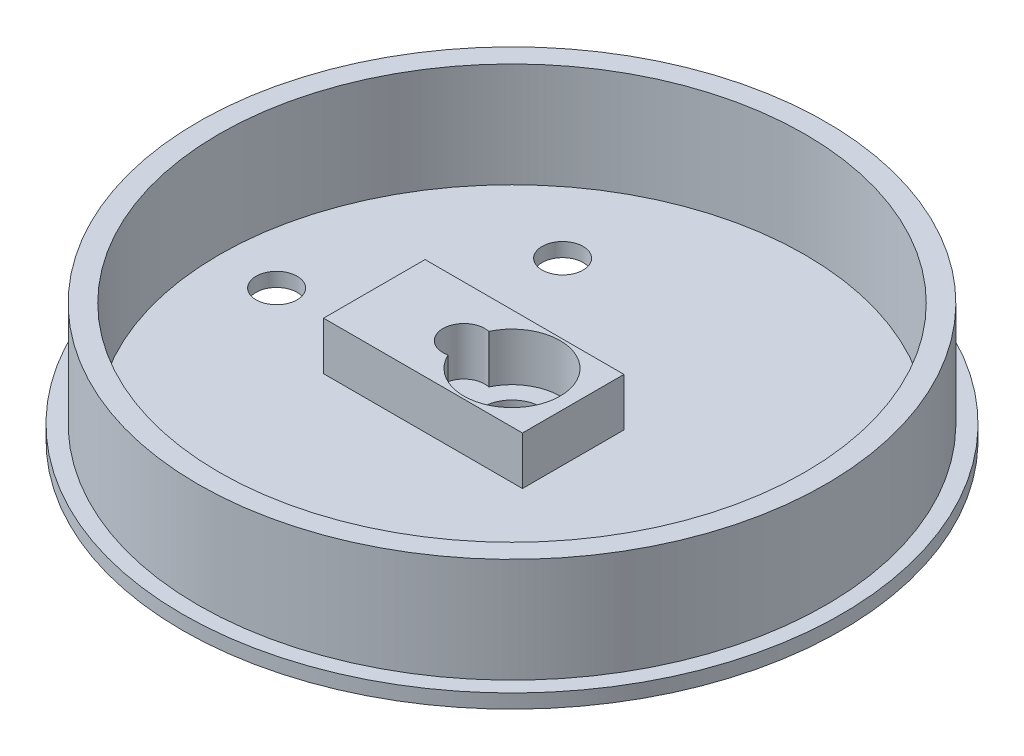
ISO-10303-21;
HEADER;
FILE_DESCRIPTION(('STEP AP214'),'2;1');
FILE_NAME('part.step','',(''),(''),'','','');
FILE_SCHEMA(('AUTOMOTIVE_DESIGN { 1 0 10303 214 1 1 1 1 }'));
ENDSEC;
DATA;
#1=APPLICATION_CONTEXT('core data for automotive mechanical design processes');
#2=APPLICATION_PROTOCOL_DEFINITION('international standard','automotive_design',2000,#1);
#3=PRODUCT_CONTEXT('',#1,'mechanical');
#4=PRODUCT('Part','Part','',(#3));
#5=PRODUCT_RELATED_PRODUCT_CATEGORY('part','',(#4));
#6=PRODUCT_DEFINITION_FORMATION('','',#4);
#7=PRODUCT_DEFINITION_CONTEXT('part definition',#1,'design');
#8=PRODUCT_DEFINITION('design','',#6,#7);
#9=PRODUCT_DEFINITION_SHAPE('','',#8);
#10=(LENGTH_UNIT() NAMED_UNIT(*) SI_UNIT(.MILLI.,.METRE.));
#11=(NAMED_UNIT(*) PLANE_ANGLE_UNIT() SI_UNIT($,.RADIAN.));
#12=(NAMED_UNIT(*) SI_UNIT($,.STERADIAN.) SOLID_ANGLE_UNIT());
#13=UNCERTAINTY_MEASURE_WITH_UNIT(LENGTH_MEASURE(1.E-05),#10,'distance_accuracy_value','');
#14=(GEOMETRIC_REPRESENTATION_CONTEXT(3) GLOBAL_UNCERTAINTY_ASSIGNED_CONTEXT((#13)) GLOBAL_UNIT_ASSIGNED_CONTEXT((#10,
#11,#12)) REPRESENTATION_CONTEXT('',''));
#15=CARTESIAN_POINT('',(0.,0.,0.));
#16=DIRECTION('',(0.,0.,1.));
#17=DIRECTION('',(1.,0.,0.));
#18=AXIS2_PLACEMENT_3D('',#15,#16,#17);
#19=CARTESIAN_POINT('',(0.,1.7018,0.));
#20=DIRECTION('',(0.,1.,0.));
#21=DIRECTION('',(0.,0.,1.));
#22=AXIS2_PLACEMENT_3D('',#19,#20,#21);
#23=PLANE('',#22);
#24=DIRECTION('',(0.,0.,-1.));
#25=VECTOR('',#24,1.);
#26=CARTESIAN_POINT('',(-16.7132,1.7018,0.));
#27=LINE('',#26,#25);
#28=CARTESIAN_POINT('',(-16.7132,1.70180000000003,6.15950000000001));
#29=VERTEX_POINT('',#28);
#30=CARTESIAN_POINT('',(-16.7132,1.70180000000003,-6.15949999999999));
#31=VERTEX_POINT('',#30);
#32=EDGE_CURVE('E168',#29,#31,#27,.T.);
#33=ORIENTED_EDGE('',*,*,#32,.T.);
#34=DIRECTION('',(-1.,0.,0.));
#35=VECTOR('',#34,1.);
#36=CARTESIAN_POINT('',(0.,1.7018,-6.1595));
#37=LINE('',#36,#35);
#38=CARTESIAN_POINT('',(7.4295,1.70180000000003,-6.1595));
#39=VERTEX_POINT('',#38);
#40=EDGE_CURVE('E171',#39,#31,#37,.T.);
#41=ORIENTED_EDGE('',*,*,#40,.F.);
#42=DIRECTION('',(0.,0.,-1.));
#43=VECTOR('',#42,1.);
#44=CARTESIAN_POINT('',(7.4295,1.7018,0.));
#45=LINE('',#44,#43);
#46=CARTESIAN_POINT('',(7.4295,1.70180000000003,6.1595));
#47=VERTEX_POINT('',#46);
#48=EDGE_CURVE('E103',#47,#39,#45,.T.);
#49=ORIENTED_EDGE('',*,*,#48,.F.);
#50=DIRECTION('',(1.,0.,0.));
#51=VECTOR('',#50,1.);
#52=CARTESIAN_POINT('',(0.,1.7018,6.1595));
#53=LINE('',#52,#51);
#54=EDGE_CURVE('E242',#29,#47,#53,.T.);
#55=ORIENTED_EDGE('',*,*,#54,.F.);
#56=EDGE_LOOP('',(#33,#41,#49,#55));
#57=FACE_BOUND('',#56,.T.);
#58=CARTESIAN_POINT('',(28.575,1.7018,0.));
#59=DIRECTION('',(0.,1.,0.));
#60=DIRECTION('',(0.,0.,1.));
#61=AXIS2_PLACEMENT_3D('',#58,#59,#60);
#62=CIRCLE('',#61,2.4892);
#63=CARTESIAN_POINT('',(28.575,1.7018,2.4892));
#64=VERTEX_POINT('',#63);
#65=EDGE_CURVE('E194',#64,#64,#62,.F.);
#66=ORIENTED_EDGE('',*,*,#65,.T.);
#67=EDGE_LOOP('',(#66));
#68=FACE_BOUND('',#67,.T.);
#69=CARTESIAN_POINT('',(-14.3480145553214,1.7018,-20.4910883878891));
#70=DIRECTION('',(0.,1.,0.));
#71=DIRECTION('',(0.,0.,1.));
#72=AXIS2_PLACEMENT_3D('',#69,#70,#71);
#73=CIRCLE('',#72,2.4892);
#74=CARTESIAN_POINT('',(-14.3480145553214,1.7018,-18.0018883878891));
#75=VERTEX_POINT('',#74);
#76=EDGE_CURVE('E176',#75,#75,#73,.T.);
#77=ORIENTED_EDGE('',*,*,#76,.F.);
#78=EDGE_LOOP('',(#77));
#79=FACE_BOUND('',#78,.T.);
#80=CARTESIAN_POINT('',(14.3480145553215,1.7018,20.4910883878891));
#81=DIRECTION('',(0.,1.,0.));
#82=DIRECTION('',(0.,0.,1.));
#83=AXIS2_PLACEMENT_3D('',#80,#81,#82);
#84=CIRCLE('',#83,2.4892);
#85=CARTESIAN_POINT('',(14.3480145553215,1.7018,22.9802883878891));
#86=VERTEX_POINT('',#85);
#87=EDGE_CURVE('E245',#86,#86,#84,.T.);
#88=ORIENTED_EDGE('',*,*,#87,.F.);
#89=EDGE_LOOP('',(#88));
#90=FACE_BOUND('',#89,.T.);
#91=CARTESIAN_POINT('',(-28.575,1.7018,0.));
#92=DIRECTION('',(0.,1.,0.));
#93=DIRECTION('',(0.,0.,1.));
#94=AXIS2_PLACEMENT_3D('',#91,#92,#93);
#95=CIRCLE('',#94,2.4892);
#96=CARTESIAN_POINT('',(-28.575,1.7018,2.4892));
#97=VERTEX_POINT('',#96);
#98=EDGE_CURVE('E190',#97,#97,#95,.T.);
#99=ORIENTED_EDGE('',*,*,#98,.F.);
#100=EDGE_LOOP('',(#99));
#101=FACE_BOUND('',#100,.T.);
#102=CARTESIAN_POINT('',(0.,1.7018,0.));
#103=DIRECTION('',(0.,1.,0.));
#104=DIRECTION('',(0.,0.,1.));
#105=AXIS2_PLACEMENT_3D('',#102,#103,#104);
#106=CIRCLE('',#105,35.56);
#107=CARTESIAN_POINT('',(0.,1.7018,35.56));
#108=VERTEX_POINT('',#107);
#109=EDGE_CURVE('E12',#108,#108,#106,.F.);
#110=ORIENTED_EDGE('',*,*,#109,.F.);
#111=EDGE_LOOP('',(#110));
#112=FACE_BOUND('',#111,.T.);
#113=ADVANCED_FACE('F95',(#57,#68,#79,#90,#101,#112),#23,.T.);
#114=CARTESIAN_POINT('',(0.,1.7018,-6.1595));
#115=DIRECTION('',(0.,0.,1.));
#116=DIRECTION('',(1.,0.,0.));
#117=AXIS2_PLACEMENT_3D('',#114,#115,#116);
#118=PLANE('',#117);
#119=DIRECTION('',(0.,-1.,0.));
#120=VECTOR('',#119,1.);
#121=CARTESIAN_POINT('',(7.4295,1.7018,-6.1595));
#122=LINE('',#121,#120);
#123=CARTESIAN_POINT('',(7.4295,7.5438,-6.1595));
#124=VERTEX_POINT('',#123);
#125=EDGE_CURVE('E162',#124,#39,#122,.T.);
#126=ORIENTED_EDGE('',*,*,#125,.T.);
#127=ORIENTED_EDGE('',*,*,#40,.T.);
#128=DIRECTION('',(0.,-1.,0.));
#129=VECTOR('',#128,1.);
#130=CARTESIAN_POINT('',(-16.7132,1.7018,-6.15949999999999));
#131=LINE('',#130,#129);
#132=CARTESIAN_POINT('',(-16.7132,7.5438,-6.15949999999999));
#133=VERTEX_POINT('',#132);
#134=EDGE_CURVE('E182',#133,#31,#131,.T.);
#135=ORIENTED_EDGE('',*,*,#134,.F.);
#136=DIRECTION('',(1.,0.,0.));
#137=VECTOR('',#136,1.);
#138=CARTESIAN_POINT('',(0.,7.5438,-6.1595));
#139=LINE('',#138,#137);
#140=EDGE_CURVE('E181',#133,#124,#139,.T.);
#141=ORIENTED_EDGE('',*,*,#140,.T.);
#142=EDGE_LOOP('',(#126,#127,#135,#141));
#143=FACE_BOUND('',#142,.T.);
#144=ADVANCED_FACE('F179',(#143),#118,.F.);
#145=DIRECTION('',(-1.,0.,0.));
#146=VECTOR('',#145,1.);
#147=CARTESIAN_POINT('',(0.,1.7018,2.4892));
#148=LINE('',#147,#146);
#149=CARTESIAN_POINT('',(-5.28515348499928,1.7018,2.4892));
#150=VERTEX_POINT('',#149);
#151=CARTESIAN_POINT('',(-5.33654638194983,1.7018,2.4892));
#152=VERTEX_POINT('',#151);
#153=EDGE_CURVE('E175',#150,#152,#148,.T.);
#154=ORIENTED_EDGE('',*,*,#153,.F.);
#155=CARTESIAN_POINT('',(0.,1.7018,0.));
#156=DIRECTION('',(0.,1.,0.));
#157=DIRECTION('',(0.,0.,1.));
#158=AXIS2_PLACEMENT_3D('',#155,#156,#157);
#159=CIRCLE('',#158,5.842);
#160=CARTESIAN_POINT('',(-5.28515348499927,1.7018,-2.48920000000001));
#161=VERTEX_POINT('',#160);
#162=EDGE_CURVE('E224',#150,#161,#159,.T.);
#163=ORIENTED_EDGE('',*,*,#162,.T.);
#164=DIRECTION('',(-1.,0.,0.));
#165=VECTOR('',#164,1.);
#166=CARTESIAN_POINT('',(0.,1.7018,-2.4892));
#167=LINE('',#166,#165);
#168=CARTESIAN_POINT('',(-5.33654638194983,1.7018,-2.4892));
#169=VERTEX_POINT('',#168);
#170=EDGE_CURVE('E228',#161,#169,#167,.T.);
#171=ORIENTED_EDGE('',*,*,#170,.T.);
#172=CARTESIAN_POINT('',(-5.842,1.7018,0.));
#173=DIRECTION('',(0.,1.,0.));
#174=DIRECTION('',(0.,0.,1.));
#175=AXIS2_PLACEMENT_3D('',#172,#173,#174);
#176=CIRCLE('',#175,2.54);
#177=EDGE_CURVE('E231',#169,#152,#176,.T.);
#178=ORIENTED_EDGE('',*,*,#177,.T.);
#179=EDGE_LOOP('',(#154,#163,#171,#178));
#180=FACE_BOUND('',#179,.T.);
#181=CARTESIAN_POINT('',(0.,1.7018,0.));
#182=DIRECTION('',(0.,1.,0.));
#183=DIRECTION('',(0.,0.,1.));
#184=AXIS2_PLACEMENT_3D('',#181,#182,#183);
#185=CIRCLE('',#184,3.556);
#186=CARTESIAN_POINT('',(0.,1.7018,3.556));
#187=VERTEX_POINT('',#186);
#188=EDGE_CURVE('E204',#187,#187,#185,.T.);
#189=ORIENTED_EDGE('',*,*,#188,.F.);
#190=EDGE_LOOP('',(#189));
#191=FACE_BOUND('',#190,.T.);
#192=ADVANCED_FACE('F292',(#180,#191),#23,.T.);
#193=CARTESIAN_POINT('',(7.4295,1.7018,0.));
#194=DIRECTION('',(1.,0.,0.));
#195=DIRECTION('',(0.,0.,-1.));
#196=AXIS2_PLACEMENT_3D('',#193,#194,#195);
#197=PLANE('',#196);
#198=ORIENTED_EDGE('',*,*,#48,.T.);
#199=ORIENTED_EDGE('',*,*,#125,.F.);
#200=DIRECTION('',(0.,0.,-1.));
#201=VECTOR('',#200,1.);
#202=CARTESIAN_POINT('',(7.4295,7.5438,0.));
#203=LINE('',#202,#201);
#204=CARTESIAN_POINT('',(7.4295,7.5438,6.1595));
#205=VERTEX_POINT('',#204);
#206=EDGE_CURVE('E215',#205,#124,#203,.T.);
#207=ORIENTED_EDGE('',*,*,#206,.F.);
#208=DIRECTION('',(0.,-1.,0.));
#209=VECTOR('',#208,1.);
#210=CARTESIAN_POINT('',(7.4295,1.7018,6.1595));
#211=LINE('',#210,#209);
#212=EDGE_CURVE('E164',#205,#47,#211,.T.);
#213=ORIENTED_EDGE('',*,*,#212,.T.);
#214=EDGE_LOOP('',(#198,#199,#207,#213));
#215=FACE_BOUND('',#214,.T.);
#216=ADVANCED_FACE('F159',(#215),#197,.T.);
#217=CARTESIAN_POINT('',(-16.7132,1.7018,0.));
#218=DIRECTION('',(1.,0.,0.));
#219=DIRECTION('',(0.,0.,-1.));
#220=AXIS2_PLACEMENT_3D('',#217,#218,#219);
#221=PLANE('',#220);
#222=ORIENTED_EDGE('',*,*,#134,.T.);
#223=ORIENTED_EDGE('',*,*,#32,.F.);
#224=DIRECTION('',(0.,-1.,0.));
#225=VECTOR('',#224,1.);
#226=CARTESIAN_POINT('',(-16.7132,1.7018,6.15950000000001));
#227=LINE('',#226,#225);
#228=CARTESIAN_POINT('',(-16.7132,7.5438,6.15950000000001));
#229=VERTEX_POINT('',#228);
#230=EDGE_CURVE('E184',#229,#29,#227,.T.);
#231=ORIENTED_EDGE('',*,*,#230,.F.);
#232=DIRECTION('',(0.,0.,-1.));
#233=VECTOR('',#232,1.);
#234=CARTESIAN_POINT('',(-16.7132,7.5438,0.));
#235=LINE('',#234,#233);
#236=EDGE_CURVE('E211',#229,#133,#235,.T.);
#237=ORIENTED_EDGE('',*,*,#236,.T.);
#238=EDGE_LOOP('',(#222,#223,#231,#237));
#239=FACE_BOUND('',#238,.T.);
#240=ADVANCED_FACE('F324',(#239),#221,.F.);
#241=CARTESIAN_POINT('',(0.,1.7018,6.1595));
#242=DIRECTION('',(0.,0.,1.));
#243=DIRECTION('',(1.,0.,0.));
#244=AXIS2_PLACEMENT_3D('',#241,#242,#243);
#245=PLANE('',#244);
#246=ORIENTED_EDGE('',*,*,#54,.T.);
#247=ORIENTED_EDGE('',*,*,#212,.F.);
#248=DIRECTION('',(1.,0.,0.));
#249=VECTOR('',#248,1.);
#250=CARTESIAN_POINT('',(0.,7.5438,6.1595));
#251=LINE('',#250,#249);
#252=EDGE_CURVE('E201',#229,#205,#251,.T.);
#253=ORIENTED_EDGE('',*,*,#252,.F.);
#254=ORIENTED_EDGE('',*,*,#230,.T.);
#255=EDGE_LOOP('',(#246,#247,#253,#254));
#256=FACE_BOUND('',#255,.T.);
#257=ADVANCED_FACE('F333',(#256),#245,.T.);
#258=CARTESIAN_POINT('',(0.,1.7018,0.));
#259=DIRECTION('',(0.,-1.,0.));
#260=DIRECTION('',(0.,0.,-1.));
#261=AXIS2_PLACEMENT_3D('',#258,#259,#260);
#262=CYLINDRICAL_SURFACE('',#261,3.556);
#263=ORIENTED_EDGE('',*,*,#188,.T.);
#264=EDGE_LOOP('',(#263));
#265=FACE_BOUND('',#264,.T.);
#266=CARTESIAN_POINT('',(0.,0.,0.));
#267=DIRECTION('',(0.,1.,0.));
#268=DIRECTION('',(0.,0.,1.));
#269=AXIS2_PLACEMENT_3D('',#266,#267,#268);
#270=CIRCLE('',#269,3.556);
#271=CARTESIAN_POINT('',(0.,0.,3.556));
#272=VERTEX_POINT('',#271);
#273=EDGE_CURVE('E195',#272,#272,#270,.T.);
#274=ORIENTED_EDGE('',*,*,#273,.F.);
#275=EDGE_LOOP('',(#274));
#276=FACE_BOUND('',#275,.T.);
#277=ADVANCED_FACE('F330',(#265,#276),#262,.F.);
#278=CARTESIAN_POINT('',(28.575,1.7018,0.));
#279=DIRECTION('',(0.,-1.,0.));
#280=DIRECTION('',(0.,0.,-1.));
#281=AXIS2_PLACEMENT_3D('',#278,#279,#280);
#282=CYLINDRICAL_SURFACE('',#281,2.4892);
#283=ORIENTED_EDGE('',*,*,#65,.F.);
#284=EDGE_LOOP('',(#283));
#285=FACE_BOUND('',#284,.T.);
#286=CARTESIAN_POINT('',(28.575,0.,0.));
#287=DIRECTION('',(0.,1.,0.));
#288=DIRECTION('',(0.,0.,1.));
#289=AXIS2_PLACEMENT_3D('',#286,#287,#288);
#290=CIRCLE('',#289,2.4892);
#291=CARTESIAN_POINT('',(28.575,0.,2.4892));
#292=VERTEX_POINT('',#291);
#293=EDGE_CURVE('E198',#292,#292,#290,.F.);
#294=ORIENTED_EDGE('',*,*,#293,.T.);
#295=EDGE_LOOP('',(#294));
#296=FACE_BOUND('',#295,.T.);
#297=ADVANCED_FACE('F97',(#285,#296),#282,.F.);
#298=CARTESIAN_POINT('',(-28.575,1.7018,0.));
#299=DIRECTION('',(0.,-1.,0.));
#300=DIRECTION('',(0.,0.,-1.));
#301=AXIS2_PLACEMENT_3D('',#298,#299,#300);
#302=CYLINDRICAL_SURFACE('',#301,2.4892);
#303=ORIENTED_EDGE('',*,*,#98,.T.);
#304=EDGE_LOOP('',(#303));
#305=FACE_BOUND('',#304,.T.);
#306=CARTESIAN_POINT('',(-28.575,0.,0.));
#307=DIRECTION('',(0.,1.,0.));
#308=DIRECTION('',(0.,0.,1.));
#309=AXIS2_PLACEMENT_3D('',#306,#307,#308);
#310=CIRCLE('',#309,2.4892);
#311=CARTESIAN_POINT('',(-28.575,0.,2.4892));
#312=VERTEX_POINT('',#311);
#313=EDGE_CURVE('E191',#312,#312,#310,.T.);
#314=ORIENTED_EDGE('',*,*,#313,.F.);
#315=EDGE_LOOP('',(#314));
#316=FACE_BOUND('',#315,.T.);
#317=ADVANCED_FACE('F290',(#305,#316),#302,.F.);
#318=CARTESIAN_POINT('',(0.,1.7018,0.));
#319=DIRECTION('',(0.,1.,0.));
#320=DIRECTION('',(0.,0.,1.));
#321=AXIS2_PLACEMENT_3D('',#318,#319,#320);
#322=CIRCLE('',#321,38.1);
#323=CARTESIAN_POINT('',(0.,1.7018,38.1));
#324=VERTEX_POINT('',#323);
#325=EDGE_CURVE('E262',#324,#324,#322,.T.);
#326=ORIENTED_EDGE('',*,*,#325,.F.);
#327=EDGE_LOOP('',(#326));
#328=FACE_BOUND('',#327,.T.);
#329=CARTESIAN_POINT('',(0.,1.7018,0.));
#330=DIRECTION('',(0.,1.,0.));
#331=DIRECTION('',(0.,0.,1.));
#332=AXIS2_PLACEMENT_3D('',#329,#330,#331);
#333=CIRCLE('',#332,40.005);
#334=CARTESIAN_POINT('',(0.,1.70179999999999,-40.005));
#335=VERTEX_POINT('',#334);
#336=EDGE_CURVE('E256',#335,#335,#333,.F.);
#337=ORIENTED_EDGE('',*,*,#336,.F.);
#338=EDGE_LOOP('',(#337));
#339=FACE_BOUND('',#338,.T.);
#340=ADVANCED_FACE('F286',(#328,#339),#23,.T.);
#341=CARTESIAN_POINT('',(0.,0.,0.));
#342=DIRECTION('',(0.,1.,0.));
#343=DIRECTION('',(0.,0.,1.));
#344=AXIS2_PLACEMENT_3D('',#341,#342,#343);
#345=PLANE('',#344);
#346=ORIENTED_EDGE('',*,*,#293,.F.);
#347=EDGE_LOOP('',(#346));
#348=FACE_BOUND('',#347,.T.);
#349=ORIENTED_EDGE('',*,*,#273,.T.);
#350=EDGE_LOOP('',(#349));
#351=FACE_BOUND('',#350,.T.);
#352=ORIENTED_EDGE('',*,*,#313,.T.);
#353=EDGE_LOOP('',(#352));
#354=FACE_BOUND('',#353,.T.);
#355=CARTESIAN_POINT('',(14.3480145553215,0.,20.4910883878891));
#356=DIRECTION('',(0.,1.,0.));
#357=DIRECTION('',(0.,0.,1.));
#358=AXIS2_PLACEMENT_3D('',#355,#356,#357);
#359=CIRCLE('',#358,2.4892);
#360=CARTESIAN_POINT('',(14.3480145553215,0.,22.9802883878891));
#361=VERTEX_POINT('',#360);
#362=EDGE_CURVE('E246',#361,#361,#359,.T.);
#363=ORIENTED_EDGE('',*,*,#362,.T.);
#364=EDGE_LOOP('',(#363));
#365=FACE_BOUND('',#364,.T.);
#366=CARTESIAN_POINT('',(-14.3480145553214,0.,-20.4910883878891));
#367=DIRECTION('',(0.,1.,0.));
#368=DIRECTION('',(0.,0.,1.));
#369=AXIS2_PLACEMENT_3D('',#366,#367,#368);
#370=CIRCLE('',#369,2.4892);
#371=CARTESIAN_POINT('',(-14.3480145553214,0.,-18.0018883878891));
#372=VERTEX_POINT('',#371);
#373=EDGE_CURVE('E244',#372,#372,#370,.T.);
#374=ORIENTED_EDGE('',*,*,#373,.T.);
#375=EDGE_LOOP('',(#374));
#376=FACE_BOUND('',#375,.T.);
#377=CARTESIAN_POINT('',(0.,0.,0.));
#378=DIRECTION('',(0.,-1.,0.));
#379=DIRECTION('',(0.,0.,-1.));
#380=AXIS2_PLACEMENT_3D('',#377,#378,#379);
#381=CIRCLE('',#380,40.005);
#382=CARTESIAN_POINT('',(0.,0.,-40.005));
#383=VERTEX_POINT('',#382);
#384=EDGE_CURVE('E249',#383,#383,#381,.T.);
#385=ORIENTED_EDGE('',*,*,#384,.T.);
#386=EDGE_LOOP('',(#385));
#387=FACE_BOUND('',#386,.T.);
#388=ADVANCED_FACE('F289',(#348,#351,#354,#365,#376,#387),#345,.F.);
#389=CARTESIAN_POINT('',(0.,7.5438,0.));
#390=DIRECTION('',(0.,-1.,0.));
#391=DIRECTION('',(0.,0.,-1.));
#392=AXIS2_PLACEMENT_3D('',#389,#390,#391);
#393=PLANE('',#392);
#394=CARTESIAN_POINT('',(0.,7.5438,0.));
#395=DIRECTION('',(0.,1.,0.));
#396=DIRECTION('',(0.,0.,1.));
#397=AXIS2_PLACEMENT_3D('',#394,#395,#396);
#398=CIRCLE('',#397,5.842);
#399=CARTESIAN_POINT('',(-5.28515348499928,7.5438,2.4892));
#400=VERTEX_POINT('',#399);
#401=CARTESIAN_POINT('',(-5.28515348499927,7.5438,-2.48920000000001));
#402=VERTEX_POINT('',#401);
#403=EDGE_CURVE('E219',#400,#402,#398,.T.);
#404=ORIENTED_EDGE('',*,*,#403,.F.);
#405=DIRECTION('',(-1.,0.,0.));
#406=VECTOR('',#405,1.);
#407=CARTESIAN_POINT('',(0.,7.5438,2.4892));
#408=LINE('',#407,#406);
#409=CARTESIAN_POINT('',(-5.33654638194983,7.5438,2.4892));
#410=VERTEX_POINT('',#409);
#411=EDGE_CURVE('E227',#400,#410,#408,.T.);
#412=ORIENTED_EDGE('',*,*,#411,.T.);
#413=CARTESIAN_POINT('',(-5.842,7.5438,0.));
#414=DIRECTION('',(0.,1.,0.));
#415=DIRECTION('',(0.,0.,1.));
#416=AXIS2_PLACEMENT_3D('',#413,#414,#415);
#417=CIRCLE('',#416,2.54);
#418=CARTESIAN_POINT('',(-5.33654638194983,7.5438,-2.4892));
#419=VERTEX_POINT('',#418);
#420=EDGE_CURVE('E238',#419,#410,#417,.T.);
#421=ORIENTED_EDGE('',*,*,#420,.F.);
#422=DIRECTION('',(-1.,0.,0.));
#423=VECTOR('',#422,1.);
#424=CARTESIAN_POINT('',(0.,7.5438,-2.4892));
#425=LINE('',#424,#423);
#426=EDGE_CURVE('E236',#402,#419,#425,.T.);
#427=ORIENTED_EDGE('',*,*,#426,.F.);
#428=EDGE_LOOP('',(#404,#412,#421,#427));
#429=FACE_BOUND('',#428,.T.);
#430=ORIENTED_EDGE('',*,*,#206,.T.);
#431=ORIENTED_EDGE('',*,*,#140,.F.);
#432=ORIENTED_EDGE('',*,*,#236,.F.);
#433=ORIENTED_EDGE('',*,*,#252,.T.);
#434=EDGE_LOOP('',(#430,#431,#432,#433));
#435=FACE_BOUND('',#434,.T.);
#436=ADVANCED_FACE('F337',(#429,#435),#393,.F.);
#437=CARTESIAN_POINT('',(0.,7.5438,2.4892));
#438=DIRECTION('',(0.,0.,1.));
#439=DIRECTION('',(1.,0.,0.));
#440=AXIS2_PLACEMENT_3D('',#437,#438,#439);
#441=PLANE('',#440);
#442=ORIENTED_EDGE('',*,*,#153,.T.);
#443=DIRECTION('',(0.,-1.,0.));
#444=VECTOR('',#443,1.);
#445=CARTESIAN_POINT('',(-5.33654638194983,7.5438,2.4892));
#446=LINE('',#445,#444);
#447=EDGE_CURVE('E110',#410,#152,#446,.T.);
#448=ORIENTED_EDGE('',*,*,#447,.F.);
#449=ORIENTED_EDGE('',*,*,#411,.F.);
#450=DIRECTION('',(0.,-1.,0.));
#451=VECTOR('',#450,1.);
#452=CARTESIAN_POINT('',(-5.28515348499928,7.5438,2.4892));
#453=LINE('',#452,#451);
#454=EDGE_CURVE('E217',#400,#150,#453,.T.);
#455=ORIENTED_EDGE('',*,*,#454,.T.);
#456=EDGE_LOOP('',(#442,#448,#449,#455));
#457=FACE_BOUND('',#456,.T.);
#458=ADVANCED_FACE('F360',(#457),#441,.F.);
#459=CARTESIAN_POINT('',(0.,7.5438,0.));
#460=DIRECTION('',(0.,-1.,0.));
#461=DIRECTION('',(0.,0.,-1.));
#462=AXIS2_PLACEMENT_3D('',#459,#460,#461);
#463=CYLINDRICAL_SURFACE('',#462,5.842);
#464=ORIENTED_EDGE('',*,*,#162,.F.);
#465=ORIENTED_EDGE('',*,*,#454,.F.);
#466=ORIENTED_EDGE('',*,*,#403,.T.);
#467=DIRECTION('',(0.,-1.,0.));
#468=VECTOR('',#467,1.);
#469=CARTESIAN_POINT('',(-5.28515348499927,7.5438,-2.48920000000001));
#470=LINE('',#469,#468);
#471=EDGE_CURVE('E221',#402,#161,#470,.T.);
#472=ORIENTED_EDGE('',*,*,#471,.T.);
#473=EDGE_LOOP('',(#464,#465,#466,#472));
#474=FACE_BOUND('',#473,.T.);
#475=ADVANCED_FACE('F357',(#474),#463,.F.);
#476=CARTESIAN_POINT('',(0.,7.5438,-2.4892));
#477=DIRECTION('',(0.,0.,1.));
#478=DIRECTION('',(1.,0.,0.));
#479=AXIS2_PLACEMENT_3D('',#476,#477,#478);
#480=PLANE('',#479);
#481=ORIENTED_EDGE('',*,*,#170,.F.);
#482=ORIENTED_EDGE('',*,*,#471,.F.);
#483=ORIENTED_EDGE('',*,*,#426,.T.);
#484=DIRECTION('',(0.,-1.,0.));
#485=VECTOR('',#484,1.);
#486=CARTESIAN_POINT('',(-5.33654638194983,7.5438,-2.4892));
#487=LINE('',#486,#485);
#488=EDGE_CURVE('E115',#419,#169,#487,.T.);
#489=ORIENTED_EDGE('',*,*,#488,.T.);
#490=EDGE_LOOP('',(#481,#482,#483,#489));
#491=FACE_BOUND('',#490,.T.);
#492=ADVANCED_FACE('F354',(#491),#480,.T.);
#493=CARTESIAN_POINT('',(-5.842,7.5438,0.));
#494=DIRECTION('',(0.,-1.,0.));
#495=DIRECTION('',(0.,0.,-1.));
#496=AXIS2_PLACEMENT_3D('',#493,#494,#495);
#497=CYLINDRICAL_SURFACE('',#496,2.54);
#498=ORIENTED_EDGE('',*,*,#177,.F.);
#499=ORIENTED_EDGE('',*,*,#488,.F.);
#500=ORIENTED_EDGE('',*,*,#420,.T.);
#501=ORIENTED_EDGE('',*,*,#447,.T.);
#502=EDGE_LOOP('',(#498,#499,#500,#501));
#503=FACE_BOUND('',#502,.T.);
#504=ADVANCED_FACE('F348',(#503),#497,.F.);
#505=CARTESIAN_POINT('',(14.3480145553215,1.7018,20.4910883878891));
#506=DIRECTION('',(0.,-1.,0.));
#507=DIRECTION('',(0.,0.,-1.));
#508=AXIS2_PLACEMENT_3D('',#505,#506,#507);
#509=CYLINDRICAL_SURFACE('',#508,2.4892);
#510=ORIENTED_EDGE('',*,*,#87,.T.);
#511=EDGE_LOOP('',(#510));
#512=FACE_BOUND('',#511,.T.);
#513=ORIENTED_EDGE('',*,*,#362,.F.);
#514=EDGE_LOOP('',(#513));
#515=FACE_BOUND('',#514,.T.);
#516=ADVANCED_FACE('F307',(#512,#515),#509,.F.);
#517=CARTESIAN_POINT('',(-14.3480145553214,1.7018,-20.4910883878891));
#518=DIRECTION('',(0.,-1.,0.));
#519=DIRECTION('',(0.,0.,-1.));
#520=AXIS2_PLACEMENT_3D('',#517,#518,#519);
#521=CYLINDRICAL_SURFACE('',#520,2.4892);
#522=ORIENTED_EDGE('',*,*,#76,.T.);
#523=EDGE_LOOP('',(#522));
#524=FACE_BOUND('',#523,.T.);
#525=ORIENTED_EDGE('',*,*,#373,.F.);
#526=EDGE_LOOP('',(#525));
#527=FACE_BOUND('',#526,.T.);
#528=ADVANCED_FACE('F297',(#524,#527),#521,.F.);
#529=CARTESIAN_POINT('',(0.,114.853027125471,0.));
#530=DIRECTION('',(0.,-1.,0.));
#531=DIRECTION('',(0.,0.,-1.));
#532=AXIS2_PLACEMENT_3D('',#529,#530,#531);
#533=CYLINDRICAL_SURFACE('',#532,40.005);
#534=CARTESIAN_POINT('',(0.,0.,-40.005));
#535=CARTESIAN_POINT('',(0.,0.0177270833333492,-40.005));
#536=CARTESIAN_POINT('',(0.,0.0354541666666846,-40.005));
#537=CARTESIAN_POINT('',(0.,0.0709083333333508,-40.005));
#538=CARTESIAN_POINT('',(0.,0.0886354166666816,-40.005));
#539=CARTESIAN_POINT('',(0.,0.124089583333343,-40.005));
#540=CARTESIAN_POINT('',(0.,0.141816666666674,-40.005));
#541=CARTESIAN_POINT('',(0.,0.17727083333334,-40.005));
#542=CARTESIAN_POINT('',(0.,0.194997916666675,-40.005));
#543=CARTESIAN_POINT('',(0.,0.230452083333346,-40.005));
#544=CARTESIAN_POINT('',(0.,0.248179166666682,-40.005));
#545=CARTESIAN_POINT('',(0.,0.283633333333348,-40.005));
#546=CARTESIAN_POINT('',(0.,0.301360416666679,-40.005));
#547=CARTESIAN_POINT('',(0.,0.33681458333334,-40.005));
#548=CARTESIAN_POINT('',(0.,0.354541666666671,-40.005));
#549=CARTESIAN_POINT('',(0.,0.389995833333337,-40.005));
#550=CARTESIAN_POINT('',(0.,0.407722916666672,-40.005));
#551=CARTESIAN_POINT('',(0.,0.443177083333343,-40.005));
#552=CARTESIAN_POINT('',(0.,0.460904166666679,-40.005));
#553=CARTESIAN_POINT('',(0.,0.496358333333345,-40.005));
#554=CARTESIAN_POINT('',(0.,0.514085416666676,-40.005));
#555=CARTESIAN_POINT('',(0.,0.549539583333337,-40.005));
#556=CARTESIAN_POINT('',(0.,0.567266666666668,-40.005));
#557=CARTESIAN_POINT('',(0.,0.602720833333334,-40.005));
#558=CARTESIAN_POINT('',(0.,0.620447916666669,-40.005));
#559=CARTESIAN_POINT('',(0.,0.65590208333334,-40.005));
#560=CARTESIAN_POINT('',(0.,0.673629166666675,-40.005));
#561=CARTESIAN_POINT('',(0.,0.709083333333342,-40.005));
#562=CARTESIAN_POINT('',(0.,0.726810416666672,-40.005));
#563=CARTESIAN_POINT('',(0.,0.762264583333334,-40.005));
#564=CARTESIAN_POINT('',(0.,0.779991666666665,-40.005));
#565=CARTESIAN_POINT('',(0.,0.815445833333331,-40.005));
#566=CARTESIAN_POINT('',(0.,0.833172916666666,-40.005));
#567=CARTESIAN_POINT('',(0.,0.868627083333337,-40.005));
#568=CARTESIAN_POINT('',(0.,0.886354166666672,-40.005));
#569=CARTESIAN_POINT('',(0.,0.921808333333339,-40.005));
#570=CARTESIAN_POINT('',(0.,0.939535416666669,-40.005));
#571=CARTESIAN_POINT('',(0.,0.974989583333331,-40.005));
#572=CARTESIAN_POINT('',(0.,0.992716666666662,-40.005));
#573=CARTESIAN_POINT('',(0.,1.02817083333333,-40.005));
#574=CARTESIAN_POINT('',(0.,1.04589791666666,-40.005));
#575=CARTESIAN_POINT('',(0.,1.08135208333333,-40.005));
#576=CARTESIAN_POINT('',(0.,1.09907916666667,-40.005));
#577=CARTESIAN_POINT('',(0.,1.13453333333334,-40.005));
#578=CARTESIAN_POINT('',(0.,1.15226041666667,-40.005));
#579=CARTESIAN_POINT('',(0.,1.18771458333333,-40.005));
#580=CARTESIAN_POINT('',(0.,1.20544166666666,-40.005));
#581=CARTESIAN_POINT('',(0.,1.24089583333332,-40.005));
#582=CARTESIAN_POINT('',(0.,1.25862291666666,-40.005));
#583=CARTESIAN_POINT('',(0.,1.29407708333333,-40.005));
#584=CARTESIAN_POINT('',(0.,1.31180416666667,-40.005));
#585=CARTESIAN_POINT('',(0.,1.34725833333333,-40.005));
#586=CARTESIAN_POINT('',(0.,1.36498541666666,-40.005));
#587=CARTESIAN_POINT('',(0.,1.40043958333332,-40.005));
#588=CARTESIAN_POINT('',(0.,1.41816666666666,-40.005));
#589=CARTESIAN_POINT('',(0.,1.45362083333332,-40.005));
#590=CARTESIAN_POINT('',(0.,1.47134791666666,-40.005));
#591=CARTESIAN_POINT('',(0.,1.50680208333333,-40.005));
#592=CARTESIAN_POINT('',(0.,1.52452916666666,-40.005));
#593=CARTESIAN_POINT('',(0.,1.55998333333333,-40.005));
#594=CARTESIAN_POINT('',(0.,1.57771041666666,-40.005));
#595=CARTESIAN_POINT('',(0.,1.61316458333332,-40.005));
#596=CARTESIAN_POINT('',(0.,1.63089166666665,-40.005));
#597=CARTESIAN_POINT('',(0.,1.66634583333332,-40.005));
#598=CARTESIAN_POINT('',(0.,1.68407291666665,-40.005));
#599=CARTESIAN_POINT('',(0.,1.70179999999999,-40.005));
#600=B_SPLINE_CURVE_WITH_KNOTS('',3,(#534,#535,#536,#537,#538,#539,#540,#541,#542,#543,#544,
#545,#546,#547,#548,#549,#550,#551,#552,#553,#554,#555,#556,#557,#558,#559,#560,#561,#562,#563,
#564,#565,#566,#567,#568,#569,#570,#571,#572,#573,#574,#575,#576,#577,#578,#579,#580,#581,#582,
#583,#584,#585,#586,#587,#588,#589,#590,#591,#592,#593,#594,#595,#596,#597,#598,#599),
.UNSPECIFIED.,.F.,.F.,(4,2,2,2,2,2,2,2,2,2,2,2,2,2,2,2,2,2,2,2,2,2,2,2,2,2,2,2,2,2,2,2,4),(0.,
0.0531812500000062,0.106362499999998,0.159543749999991,0.212724999999997,0.265906250000003,
0.319087499999995,0.372268749999988,0.425449999999994,0.47863125,0.531812499999992,
0.584993749999985,0.638174999999991,0.691356249999997,0.744537499999989,0.797718749999982,
0.850899999999988,0.904081249999994,0.957262499999986,1.01044374999998,1.06362499999998,
1.11680624999999,1.16998749999998,1.22316874999998,1.27634999999998,1.32953124999999,
1.38271249999998,1.43589374999997,1.48907499999998,1.54225624999998,1.59543749999998,
1.64861874999997,1.70179999999998),.UNSPECIFIED.);
#601=EDGE_CURVE('BSEAM295',#383,#335,#600,.T.);
#602=ORIENTED_EDGE('',*,*,#384,.F.);
#603=ORIENTED_EDGE('',*,*,#336,.T.);
#604=ORIENTED_EDGE('',*,*,#601,.T.);
#605=ORIENTED_EDGE('',*,*,#601,.F.);
#606=EDGE_LOOP('',(#602,#604,#603,#605));
#607=FACE_BOUND('',#606,.T.);
#608=ADVANCED_FACE('F295',(#607),#533,.T.);
#609=CARTESIAN_POINT('',(0.,14.4018,0.));
#610=DIRECTION('',(0.,-1.,0.));
#611=DIRECTION('',(0.,0.,-1.));
#612=AXIS2_PLACEMENT_3D('',#609,#610,#611);
#613=CYLINDRICAL_SURFACE('',#612,35.56);
#614=CARTESIAN_POINT('',(0.,14.4018,0.));
#615=DIRECTION('',(0.,1.,0.));
#616=DIRECTION('',(0.,0.,1.));
#617=AXIS2_PLACEMENT_3D('',#614,#615,#616);
#618=CIRCLE('',#617,35.56);
#619=CARTESIAN_POINT('',(0.,14.4018,35.56));
#620=VERTEX_POINT('',#619);
#621=EDGE_CURVE('E265',#620,#620,#618,.T.);
#622=ORIENTED_EDGE('',*,*,#621,.T.);
#623=EDGE_LOOP('',(#622));
#624=FACE_BOUND('',#623,.T.);
#625=ORIENTED_EDGE('',*,*,#109,.T.);
#626=EDGE_LOOP('',(#625));
#627=FACE_BOUND('',#626,.T.);
#628=ADVANCED_FACE('F271',(#624,#627),#613,.F.);
#629=CARTESIAN_POINT('',(0.,14.4018,0.));
#630=DIRECTION('',(0.,-1.,0.));
#631=DIRECTION('',(0.,0.,-1.));
#632=AXIS2_PLACEMENT_3D('',#629,#630,#631);
#633=CYLINDRICAL_SURFACE('',#632,38.1);
#634=CARTESIAN_POINT('',(0.,14.4018,0.));
#635=DIRECTION('',(0.,1.,0.));
#636=DIRECTION('',(0.,0.,1.));
#637=AXIS2_PLACEMENT_3D('',#634,#635,#636);
#638=CIRCLE('',#637,38.1);
#639=CARTESIAN_POINT('',(0.,14.4018,38.1));
#640=VERTEX_POINT('',#639);
#641=EDGE_CURVE('E259',#640,#640,#638,.T.);
#642=ORIENTED_EDGE('',*,*,#641,.F.);
#643=EDGE_LOOP('',(#642));
#644=FACE_BOUND('',#643,.T.);
#645=ORIENTED_EDGE('',*,*,#325,.T.);
#646=EDGE_LOOP('',(#645));
#647=FACE_BOUND('',#646,.T.);
#648=ADVANCED_FACE('F277',(#644,#647),#633,.T.);
#649=CARTESIAN_POINT('',(0.,14.4018,0.));
#650=DIRECTION('',(0.,1.,0.));
#651=DIRECTION('',(0.,0.,1.));
#652=AXIS2_PLACEMENT_3D('',#649,#650,#651);
#653=PLANE('',#652);
#654=ORIENTED_EDGE('',*,*,#621,.F.);
#655=EDGE_LOOP('',(#654));
#656=FACE_BOUND('',#655,.T.);
#657=ORIENTED_EDGE('',*,*,#641,.T.);
#658=EDGE_LOOP('',(#657));
#659=FACE_BOUND('',#658,.T.);
#660=ADVANCED_FACE('F274',(#656,#659),#653,.T.);
#661=CLOSED_SHELL('',(#113,#144,#192,#216,#240,#257,#277,#297,#317,#340,#388,#436,#458,#475,
#492,#504,#516,#528,#608,#628,#648,#660));
#662=MANIFOLD_SOLID_BREP('B2',#661);
#663=ADVANCED_BREP_SHAPE_REPRESENTATION('',(#18,#662),#14);
#664=SHAPE_DEFINITION_REPRESENTATION(#9,#663);
ENDSEC;
END-ISO-10303-21;
